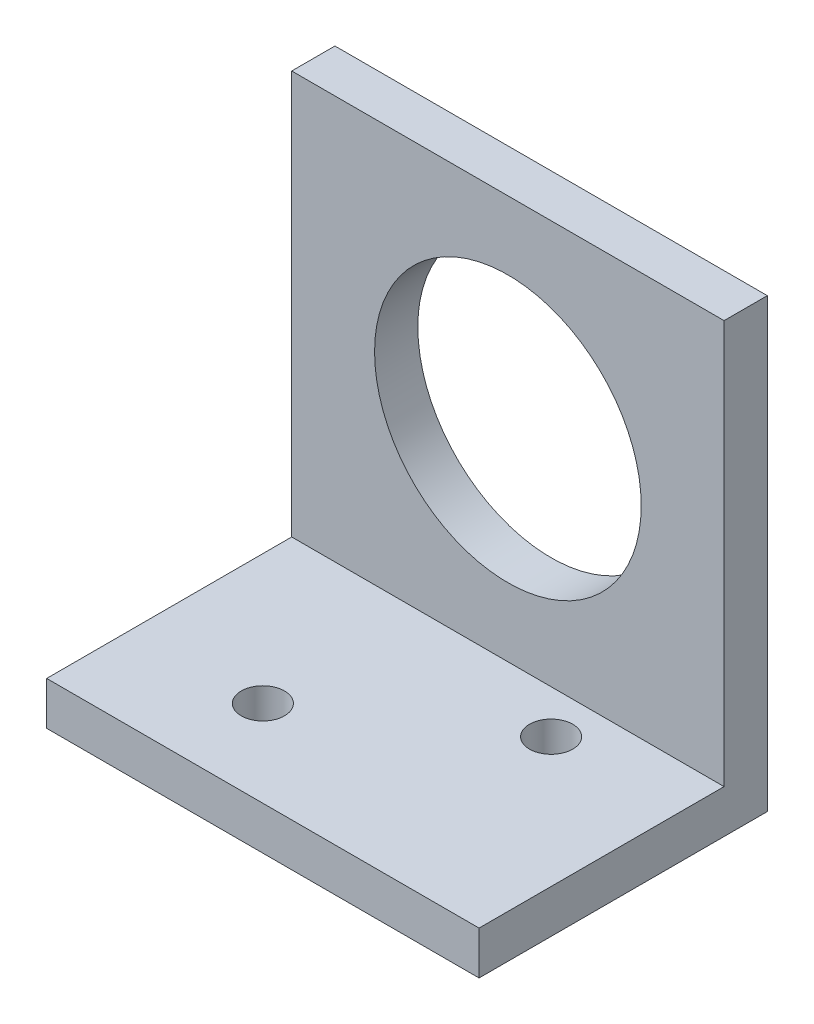
ISO-10303-21;
HEADER;
FILE_DESCRIPTION(('STEP AP214'),'2;1');
FILE_NAME('part.step','',(''),(''),'','','');
FILE_SCHEMA(('AUTOMOTIVE_DESIGN { 1 0 10303 214 1 1 1 1 }'));
ENDSEC;
DATA;
#1=APPLICATION_CONTEXT('core data for automotive mechanical design processes');
#2=APPLICATION_PROTOCOL_DEFINITION('international standard','automotive_design',2000,#1);
#3=PRODUCT_CONTEXT('',#1,'mechanical');
#4=PRODUCT('Part','Part','',(#3));
#5=PRODUCT_RELATED_PRODUCT_CATEGORY('part','',(#4));
#6=PRODUCT_DEFINITION_FORMATION('','',#4);
#7=PRODUCT_DEFINITION_CONTEXT('part definition',#1,'design');
#8=PRODUCT_DEFINITION('design','',#6,#7);
#9=PRODUCT_DEFINITION_SHAPE('','',#8);
#10=(LENGTH_UNIT() NAMED_UNIT(*) SI_UNIT(.MILLI.,.METRE.));
#11=(NAMED_UNIT(*) PLANE_ANGLE_UNIT() SI_UNIT($,.RADIAN.));
#12=(NAMED_UNIT(*) SI_UNIT($,.STERADIAN.) SOLID_ANGLE_UNIT());
#13=UNCERTAINTY_MEASURE_WITH_UNIT(LENGTH_MEASURE(1.E-05),#10,'distance_accuracy_value','');
#14=(GEOMETRIC_REPRESENTATION_CONTEXT(3) GLOBAL_UNCERTAINTY_ASSIGNED_CONTEXT((#13)) GLOBAL_UNIT_ASSIGNED_CONTEXT((#10,
#11,#12)) REPRESENTATION_CONTEXT('',''));
#15=CARTESIAN_POINT('',(0.,0.,0.));
#16=DIRECTION('',(0.,0.,1.));
#17=DIRECTION('',(1.,0.,0.));
#18=AXIS2_PLACEMENT_3D('',#15,#16,#17);
#19=CARTESIAN_POINT('',(0.,3.,0.));
#20=DIRECTION('',(0.,-1.,0.));
#21=DIRECTION('',(0.,0.,-1.));
#22=AXIS2_PLACEMENT_3D('',#19,#20,#21);
#23=PLANE('',#22);
#24=CARTESIAN_POINT('',(6.,3.,-4.));
#25=DIRECTION('',(0.,1.,0.));
#26=DIRECTION('',(0.,0.,1.));
#27=AXIS2_PLACEMENT_3D('',#24,#25,#26);
#28=CIRCLE('',#27,1.5);
#29=CARTESIAN_POINT('',(6.,3.,-2.5));
#30=VERTEX_POINT('',#29);
#31=EDGE_CURVE('E164',#30,#30,#28,.T.);
#32=ORIENTED_EDGE('',*,*,#31,.F.);
#33=EDGE_LOOP('',(#32));
#34=FACE_BOUND('',#33,.T.);
#35=CARTESIAN_POINT('',(-6.,3.,4.));
#36=DIRECTION('',(0.,1.,0.));
#37=DIRECTION('',(0.,0.,1.));
#38=AXIS2_PLACEMENT_3D('',#35,#36,#37);
#39=CIRCLE('',#38,1.5);
#40=CARTESIAN_POINT('',(-6.,3.,5.5));
#41=VERTEX_POINT('',#40);
#42=EDGE_CURVE('E109',#41,#41,#39,.T.);
#43=ORIENTED_EDGE('',*,*,#42,.F.);
#44=EDGE_LOOP('',(#43));
#45=FACE_BOUND('',#44,.T.);
#46=DIRECTION('',(1.,0.,0.));
#47=VECTOR('',#46,1.);
#48=CARTESIAN_POINT('',(-15.,3.,-7.));
#49=LINE('',#48,#47);
#50=CARTESIAN_POINT('',(-15.,3.,-7.));
#51=VERTEX_POINT('',#50);
#52=CARTESIAN_POINT('',(15.,3.,-7.));
#53=VERTEX_POINT('',#52);
#54=EDGE_CURVE('E59',#51,#53,#49,.T.);
#55=ORIENTED_EDGE('',*,*,#54,.F.);
#56=DIRECTION('',(0.,0.,1.));
#57=VECTOR('',#56,1.);
#58=CARTESIAN_POINT('',(-15.,3.,10.));
#59=LINE('',#58,#57);
#60=CARTESIAN_POINT('',(-15.,3.,10.));
#61=VERTEX_POINT('',#60);
#62=EDGE_CURVE('E175',#51,#61,#59,.T.);
#63=ORIENTED_EDGE('',*,*,#62,.T.);
#64=DIRECTION('',(1.,0.,0.));
#65=VECTOR('',#64,1.);
#66=CARTESIAN_POINT('',(-15.,3.,10.));
#67=LINE('',#66,#65);
#68=CARTESIAN_POINT('',(15.,3.,10.));
#69=VERTEX_POINT('',#68);
#70=EDGE_CURVE('E65',#61,#69,#67,.T.);
#71=ORIENTED_EDGE('',*,*,#70,.T.);
#72=DIRECTION('',(0.,0.,-1.));
#73=VECTOR('',#72,1.);
#74=CARTESIAN_POINT('',(15.,3.,10.));
#75=LINE('',#74,#73);
#76=EDGE_CURVE('E95',#69,#53,#75,.T.);
#77=ORIENTED_EDGE('',*,*,#76,.T.);
#78=EDGE_LOOP('',(#55,#63,#71,#77));
#79=FACE_BOUND('',#78,.T.);
#80=ADVANCED_FACE('F43',(#34,#45,#79),#23,.F.);
#81=CARTESIAN_POINT('',(0.,0.,0.));
#82=DIRECTION('',(0.,-1.,0.));
#83=DIRECTION('',(0.,0.,-1.));
#84=AXIS2_PLACEMENT_3D('',#81,#82,#83);
#85=PLANE('',#84);
#86=CARTESIAN_POINT('',(-6.,0.,4.));
#87=DIRECTION('',(0.,1.,0.));
#88=DIRECTION('',(0.,0.,1.));
#89=AXIS2_PLACEMENT_3D('',#86,#87,#88);
#90=CIRCLE('',#89,1.5);
#91=CARTESIAN_POINT('',(-6.,0.,5.5));
#92=VERTEX_POINT('',#91);
#93=EDGE_CURVE('E115',#92,#92,#90,.T.);
#94=ORIENTED_EDGE('',*,*,#93,.T.);
#95=EDGE_LOOP('',(#94));
#96=FACE_BOUND('',#95,.T.);
#97=DIRECTION('',(0.,0.,-1.));
#98=VECTOR('',#97,1.);
#99=CARTESIAN_POINT('',(15.,0.,10.));
#100=LINE('',#99,#98);
#101=CARTESIAN_POINT('',(15.,0.,10.));
#102=VERTEX_POINT('',#101);
#103=CARTESIAN_POINT('',(15.,0.,-10.));
#104=VERTEX_POINT('',#103);
#105=EDGE_CURVE('E101',#102,#104,#100,.T.);
#106=ORIENTED_EDGE('',*,*,#105,.F.);
#107=DIRECTION('',(1.,0.,0.));
#108=VECTOR('',#107,1.);
#109=CARTESIAN_POINT('',(-15.,0.,10.));
#110=LINE('',#109,#108);
#111=CARTESIAN_POINT('',(-15.,0.,10.));
#112=VERTEX_POINT('',#111);
#113=EDGE_CURVE('E84',#112,#102,#110,.T.);
#114=ORIENTED_EDGE('',*,*,#113,.F.);
#115=DIRECTION('',(0.,0.,1.));
#116=VECTOR('',#115,1.);
#117=CARTESIAN_POINT('',(-15.,0.,10.));
#118=LINE('',#117,#116);
#119=CARTESIAN_POINT('',(-15.,0.,-10.));
#120=VERTEX_POINT('',#119);
#121=EDGE_CURVE('E96',#120,#112,#118,.T.);
#122=ORIENTED_EDGE('',*,*,#121,.F.);
#123=DIRECTION('',(-1.,0.,0.));
#124=VECTOR('',#123,1.);
#125=CARTESIAN_POINT('',(-15.,0.,-10.));
#126=LINE('',#125,#124);
#127=EDGE_CURVE('E107',#104,#120,#126,.T.);
#128=ORIENTED_EDGE('',*,*,#127,.F.);
#129=EDGE_LOOP('',(#106,#114,#122,#128));
#130=FACE_BOUND('',#129,.T.);
#131=CARTESIAN_POINT('',(6.,0.,-4.));
#132=DIRECTION('',(0.,1.,0.));
#133=DIRECTION('',(0.,0.,1.));
#134=AXIS2_PLACEMENT_3D('',#131,#132,#133);
#135=CIRCLE('',#134,1.5);
#136=CARTESIAN_POINT('',(6.,0.,-2.5));
#137=VERTEX_POINT('',#136);
#138=EDGE_CURVE('E163',#137,#137,#135,.T.);
#139=ORIENTED_EDGE('',*,*,#138,.T.);
#140=EDGE_LOOP('',(#139));
#141=FACE_BOUND('',#140,.T.);
#142=ADVANCED_FACE('F105',(#96,#130,#141),#85,.T.);
#143=CARTESIAN_POINT('',(15.,3.,10.));
#144=DIRECTION('',(-1.,0.,0.));
#145=DIRECTION('',(0.,0.,1.));
#146=AXIS2_PLACEMENT_3D('',#143,#144,#145);
#147=PLANE('',#146);
#148=ORIENTED_EDGE('',*,*,#105,.T.);
#149=DIRECTION('',(0.,-1.,0.));
#150=VECTOR('',#149,1.);
#151=CARTESIAN_POINT('',(15.,3.,-10.));
#152=LINE('',#151,#150);
#153=CARTESIAN_POINT('',(15.,31.,-10.));
#154=VERTEX_POINT('',#153);
#155=EDGE_CURVE('E11',#154,#104,#152,.T.);
#156=ORIENTED_EDGE('',*,*,#155,.F.);
#157=DIRECTION('',(0.,0.,-1.));
#158=VECTOR('',#157,1.);
#159=CARTESIAN_POINT('',(15.,31.,-10.));
#160=LINE('',#159,#158);
#161=CARTESIAN_POINT('',(15.,31.,-7.));
#162=VERTEX_POINT('',#161);
#163=EDGE_CURVE('E145',#162,#154,#160,.T.);
#164=ORIENTED_EDGE('',*,*,#163,.F.);
#165=DIRECTION('',(0.,-1.,0.));
#166=VECTOR('',#165,1.);
#167=CARTESIAN_POINT('',(15.,31.,-7.));
#168=LINE('',#167,#166);
#169=EDGE_CURVE('E147',#162,#53,#168,.T.);
#170=ORIENTED_EDGE('',*,*,#169,.T.);
#171=ORIENTED_EDGE('',*,*,#76,.F.);
#172=DIRECTION('',(0.,-1.,0.));
#173=VECTOR('',#172,1.);
#174=CARTESIAN_POINT('',(15.,3.,10.));
#175=LINE('',#174,#173);
#176=EDGE_CURVE('E87',#69,#102,#175,.T.);
#177=ORIENTED_EDGE('',*,*,#176,.T.);
#178=EDGE_LOOP('',(#148,#156,#164,#170,#171,#177));
#179=FACE_BOUND('',#178,.T.);
#180=ADVANCED_FACE('F45',(#179),#147,.F.);
#181=CARTESIAN_POINT('',(-15.,3.,-10.));
#182=DIRECTION('',(0.,0.,1.));
#183=DIRECTION('',(1.,0.,0.));
#184=AXIS2_PLACEMENT_3D('',#181,#182,#183);
#185=PLANE('',#184);
#186=CARTESIAN_POINT('',(0.,17.,-10.));
#187=DIRECTION('',(0.,0.,1.));
#188=DIRECTION('',(1.,0.,0.));
#189=AXIS2_PLACEMENT_3D('',#186,#187,#188);
#190=CIRCLE('',#189,9.25);
#191=CARTESIAN_POINT('',(9.25,17.,-10.));
#192=VERTEX_POINT('',#191);
#193=EDGE_CURVE('E158',#192,#192,#190,.T.);
#194=ORIENTED_EDGE('',*,*,#193,.T.);
#195=EDGE_LOOP('',(#194));
#196=FACE_BOUND('',#195,.T.);
#197=ORIENTED_EDGE('',*,*,#127,.T.);
#198=DIRECTION('',(0.,-1.,0.));
#199=VECTOR('',#198,1.);
#200=CARTESIAN_POINT('',(-15.,3.,-10.));
#201=LINE('',#200,#199);
#202=CARTESIAN_POINT('',(-15.,31.,-10.));
#203=VERTEX_POINT('',#202);
#204=EDGE_CURVE('E52',#203,#120,#201,.T.);
#205=ORIENTED_EDGE('',*,*,#204,.F.);
#206=DIRECTION('',(-1.,0.,0.));
#207=VECTOR('',#206,1.);
#208=CARTESIAN_POINT('',(-15.,31.,-10.));
#209=LINE('',#208,#207);
#210=EDGE_CURVE('E137',#154,#203,#209,.T.);
#211=ORIENTED_EDGE('',*,*,#210,.F.);
#212=ORIENTED_EDGE('',*,*,#155,.T.);
#213=EDGE_LOOP('',(#197,#205,#211,#212));
#214=FACE_BOUND('',#213,.T.);
#215=ADVANCED_FACE('F135',(#196,#214),#185,.F.);
#216=CARTESIAN_POINT('',(-15.,3.,10.));
#217=DIRECTION('',(1.,0.,0.));
#218=DIRECTION('',(0.,0.,-1.));
#219=AXIS2_PLACEMENT_3D('',#216,#217,#218);
#220=PLANE('',#219);
#221=ORIENTED_EDGE('',*,*,#121,.T.);
#222=DIRECTION('',(0.,-1.,0.));
#223=VECTOR('',#222,1.);
#224=CARTESIAN_POINT('',(-15.,3.,10.));
#225=LINE('',#224,#223);
#226=EDGE_CURVE('E90',#61,#112,#225,.T.);
#227=ORIENTED_EDGE('',*,*,#226,.F.);
#228=ORIENTED_EDGE('',*,*,#62,.F.);
#229=DIRECTION('',(0.,-1.,0.));
#230=VECTOR('',#229,1.);
#231=CARTESIAN_POINT('',(-15.,31.,-7.));
#232=LINE('',#231,#230);
#233=CARTESIAN_POINT('',(-15.,31.,-7.));
#234=VERTEX_POINT('',#233);
#235=EDGE_CURVE('E151',#234,#51,#232,.T.);
#236=ORIENTED_EDGE('',*,*,#235,.F.);
#237=DIRECTION('',(0.,0.,1.));
#238=VECTOR('',#237,1.);
#239=CARTESIAN_POINT('',(-15.,31.,-10.));
#240=LINE('',#239,#238);
#241=EDGE_CURVE('E131',#203,#234,#240,.T.);
#242=ORIENTED_EDGE('',*,*,#241,.F.);
#243=ORIENTED_EDGE('',*,*,#204,.T.);
#244=EDGE_LOOP('',(#221,#227,#228,#236,#242,#243));
#245=FACE_BOUND('',#244,.T.);
#246=ADVANCED_FACE('F128',(#245),#220,.F.);
#247=CARTESIAN_POINT('',(-15.,3.,10.));
#248=DIRECTION('',(0.,0.,-1.));
#249=DIRECTION('',(-1.,0.,0.));
#250=AXIS2_PLACEMENT_3D('',#247,#248,#249);
#251=PLANE('',#250);
#252=ORIENTED_EDGE('',*,*,#113,.T.);
#253=ORIENTED_EDGE('',*,*,#176,.F.);
#254=ORIENTED_EDGE('',*,*,#70,.F.);
#255=ORIENTED_EDGE('',*,*,#226,.T.);
#256=EDGE_LOOP('',(#252,#253,#254,#255));
#257=FACE_BOUND('',#256,.T.);
#258=ADVANCED_FACE('F86',(#257),#251,.F.);
#259=CARTESIAN_POINT('',(-6.,3.,4.));
#260=DIRECTION('',(0.,-1.,0.));
#261=DIRECTION('',(0.,0.,-1.));
#262=AXIS2_PLACEMENT_3D('',#259,#260,#261);
#263=CYLINDRICAL_SURFACE('',#262,1.5);
#264=ORIENTED_EDGE('',*,*,#42,.T.);
#265=EDGE_LOOP('',(#264));
#266=FACE_BOUND('',#265,.T.);
#267=ORIENTED_EDGE('',*,*,#93,.F.);
#268=EDGE_LOOP('',(#267));
#269=FACE_BOUND('',#268,.T.);
#270=ADVANCED_FACE('F208',(#266,#269),#263,.F.);
#271=CARTESIAN_POINT('',(6.,3.,-4.));
#272=DIRECTION('',(0.,-1.,0.));
#273=DIRECTION('',(0.,0.,-1.));
#274=AXIS2_PLACEMENT_3D('',#271,#272,#273);
#275=CYLINDRICAL_SURFACE('',#274,1.5);
#276=ORIENTED_EDGE('',*,*,#31,.T.);
#277=EDGE_LOOP('',(#276));
#278=FACE_BOUND('',#277,.T.);
#279=ORIENTED_EDGE('',*,*,#138,.F.);
#280=EDGE_LOOP('',(#279));
#281=FACE_BOUND('',#280,.T.);
#282=ADVANCED_FACE('F201',(#278,#281),#275,.F.);
#283=CARTESIAN_POINT('',(-15.,31.,-7.));
#284=DIRECTION('',(0.,0.,-1.));
#285=DIRECTION('',(-1.,0.,0.));
#286=AXIS2_PLACEMENT_3D('',#283,#284,#285);
#287=PLANE('',#286);
#288=CARTESIAN_POINT('',(0.,17.,-7.));
#289=DIRECTION('',(0.,0.,1.));
#290=DIRECTION('',(1.,0.,0.));
#291=AXIS2_PLACEMENT_3D('',#288,#289,#290);
#292=CIRCLE('',#291,9.25);
#293=CARTESIAN_POINT('',(9.25,17.,-7.));
#294=VERTEX_POINT('',#293);
#295=EDGE_CURVE('E192',#294,#294,#292,.T.);
#296=ORIENTED_EDGE('',*,*,#295,.F.);
#297=EDGE_LOOP('',(#296));
#298=FACE_BOUND('',#297,.T.);
#299=ORIENTED_EDGE('',*,*,#54,.T.);
#300=ORIENTED_EDGE('',*,*,#169,.F.);
#301=DIRECTION('',(1.,0.,0.));
#302=VECTOR('',#301,1.);
#303=CARTESIAN_POINT('',(-15.,31.,-7.));
#304=LINE('',#303,#302);
#305=EDGE_CURVE('E153',#234,#162,#304,.T.);
#306=ORIENTED_EDGE('',*,*,#305,.F.);
#307=ORIENTED_EDGE('',*,*,#235,.T.);
#308=EDGE_LOOP('',(#299,#300,#306,#307));
#309=FACE_BOUND('',#308,.T.);
#310=ADVANCED_FACE('F180',(#298,#309),#287,.F.);
#311=CARTESIAN_POINT('',(0.,31.,0.));
#312=DIRECTION('',(0.,1.,0.));
#313=DIRECTION('',(0.,0.,1.));
#314=AXIS2_PLACEMENT_3D('',#311,#312,#313);
#315=PLANE('',#314);
#316=ORIENTED_EDGE('',*,*,#241,.T.);
#317=ORIENTED_EDGE('',*,*,#305,.T.);
#318=ORIENTED_EDGE('',*,*,#163,.T.);
#319=ORIENTED_EDGE('',*,*,#210,.T.);
#320=EDGE_LOOP('',(#316,#317,#318,#319));
#321=FACE_BOUND('',#320,.T.);
#322=ADVANCED_FACE('F141',(#321),#315,.T.);
#323=CARTESIAN_POINT('',(0.,17.,-24.));
#324=DIRECTION('',(0.,0.,1.));
#325=DIRECTION('',(1.,0.,0.));
#326=AXIS2_PLACEMENT_3D('',#323,#324,#325);
#327=CYLINDRICAL_SURFACE('',#326,9.25);
#328=ORIENTED_EDGE('',*,*,#295,.T.);
#329=EDGE_LOOP('',(#328));
#330=FACE_BOUND('',#329,.T.);
#331=ORIENTED_EDGE('',*,*,#193,.F.);
#332=EDGE_LOOP('',(#331));
#333=FACE_BOUND('',#332,.T.);
#334=ADVANCED_FACE('F197',(#330,#333),#327,.F.);
#335=CLOSED_SHELL('',(#80,#142,#180,#215,#246,#258,#270,#282,#310,#322,#334));
#336=MANIFOLD_SOLID_BREP('B2',#335);
#337=ADVANCED_BREP_SHAPE_REPRESENTATION('',(#18,#336),#14);
#338=SHAPE_DEFINITION_REPRESENTATION(#9,#337);
ENDSEC;
END-ISO-10303-21;
